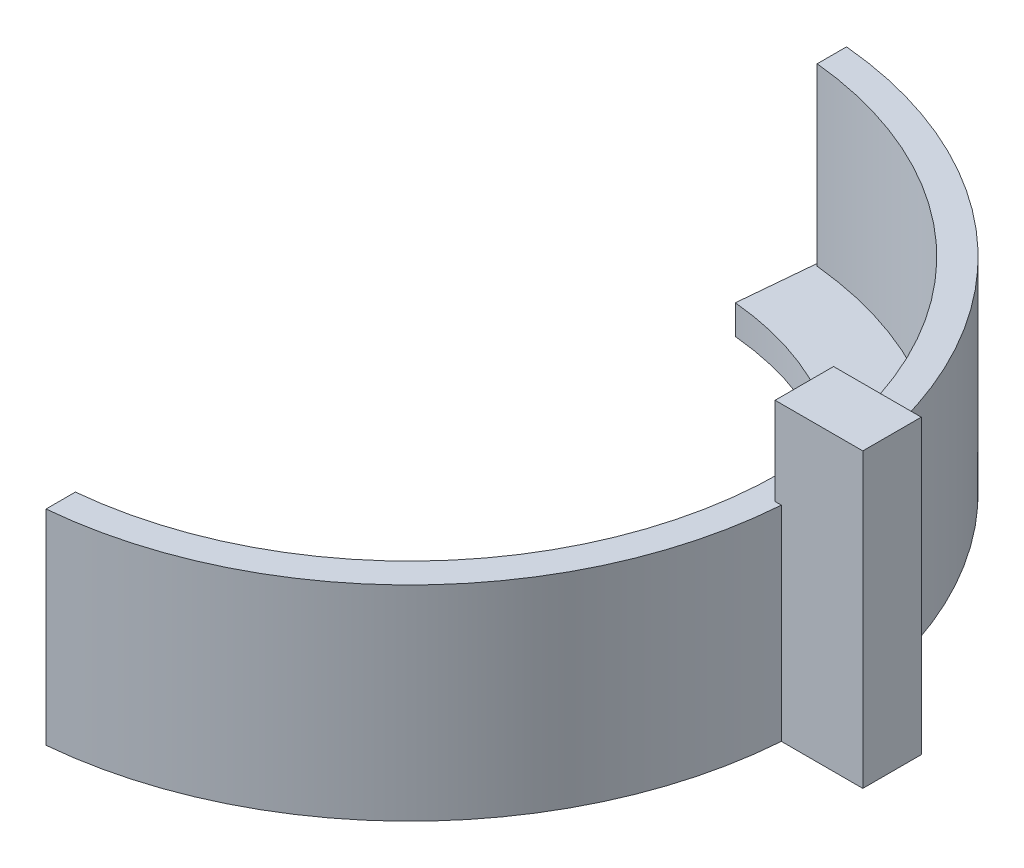
ISO-10303-21;
HEADER;
FILE_DESCRIPTION(('STEP AP214'),'2;1');
FILE_NAME('part.step','',(''),(''),'','','');
FILE_SCHEMA(('AUTOMOTIVE_DESIGN { 1 0 10303 214 1 1 1 1 }'));
ENDSEC;
DATA;
#1=APPLICATION_CONTEXT('core data for automotive mechanical design processes');
#2=APPLICATION_PROTOCOL_DEFINITION('international standard','automotive_design',2000,#1);
#3=PRODUCT_CONTEXT('',#1,'mechanical');
#4=PRODUCT('Part','Part','',(#3));
#5=PRODUCT_RELATED_PRODUCT_CATEGORY('part','',(#4));
#6=PRODUCT_DEFINITION_FORMATION('','',#4);
#7=PRODUCT_DEFINITION_CONTEXT('part definition',#1,'design');
#8=PRODUCT_DEFINITION('design','',#6,#7);
#9=PRODUCT_DEFINITION_SHAPE('','',#8);
#10=(LENGTH_UNIT() NAMED_UNIT(*) SI_UNIT(.MILLI.,.METRE.));
#11=(NAMED_UNIT(*) PLANE_ANGLE_UNIT() SI_UNIT($,.RADIAN.));
#12=(NAMED_UNIT(*) SI_UNIT($,.STERADIAN.) SOLID_ANGLE_UNIT());
#13=UNCERTAINTY_MEASURE_WITH_UNIT(LENGTH_MEASURE(1.E-05),#10,'distance_accuracy_value','');
#14=(GEOMETRIC_REPRESENTATION_CONTEXT(3) GLOBAL_UNCERTAINTY_ASSIGNED_CONTEXT((#13)) GLOBAL_UNIT_ASSIGNED_CONTEXT((#10,
#11,#12)) REPRESENTATION_CONTEXT('',''));
#15=CARTESIAN_POINT('',(0.,0.,0.));
#16=DIRECTION('',(0.,0.,1.));
#17=DIRECTION('',(1.,0.,0.));
#18=AXIS2_PLACEMENT_3D('',#15,#16,#17);
#19=CARTESIAN_POINT('',(0.,12.,0.));
#20=DIRECTION('',(0.,-1.,0.));
#21=DIRECTION('',(0.,0.,-1.));
#22=AXIS2_PLACEMENT_3D('',#19,#20,#21);
#23=CYLINDRICAL_SURFACE('',#22,27.5);
#24=DIRECTION('',(0.,-1.,0.));
#25=VECTOR('',#24,1.);
#26=CARTESIAN_POINT('',(27.427176303805,12.,-2.));
#27=LINE('',#26,#25);
#28=CARTESIAN_POINT('',(27.4271763038049,-2.,-2.));
#29=VERTEX_POINT('',#28);
#30=CARTESIAN_POINT('',(27.427176303805,12.,-2.));
#31=VERTEX_POINT('',#30);
#32=EDGE_CURVE('E176',#29,#31,#27,.F.);
#33=ORIENTED_EDGE('',*,*,#32,.F.);
#34=CARTESIAN_POINT('',(0.,-2.,0.));
#35=DIRECTION('',(0.,1.,0.));
#36=DIRECTION('',(0.,0.,-1.));
#37=AXIS2_PLACEMENT_3D('',#34,#35,#36);
#38=CIRCLE('',#37,27.5);
#39=CARTESIAN_POINT('',(2.5,-2.,-27.3861278752583));
#40=VERTEX_POINT('',#39);
#41=EDGE_CURVE('E167',#29,#40,#38,.T.);
#42=ORIENTED_EDGE('',*,*,#41,.T.);
#43=DIRECTION('',(0.,1.,0.));
#44=VECTOR('',#43,1.);
#45=CARTESIAN_POINT('',(2.5,-2.,-27.3861278752583));
#46=LINE('',#45,#44);
#47=CARTESIAN_POINT('',(2.5,0.,-27.3861278752583));
#48=VERTEX_POINT('',#47);
#49=EDGE_CURVE('E148',#40,#48,#46,.T.);
#50=ORIENTED_EDGE('',*,*,#49,.T.);
#51=DIRECTION('',(0.,-1.,0.));
#52=VECTOR('',#51,1.);
#53=CARTESIAN_POINT('',(2.5,12.,-27.3861278752583));
#54=LINE('',#53,#52);
#55=CARTESIAN_POINT('',(2.5,12.,-27.3861278752583));
#56=VERTEX_POINT('',#55);
#57=EDGE_CURVE('E11',#56,#48,#54,.T.);
#58=ORIENTED_EDGE('',*,*,#57,.F.);
#59=CARTESIAN_POINT('',(0.,12.,0.));
#60=DIRECTION('',(0.,1.,0.));
#61=DIRECTION('',(0.,0.,1.));
#62=AXIS2_PLACEMENT_3D('',#59,#60,#61);
#63=CIRCLE('',#62,27.5);
#64=EDGE_CURVE('E102',#31,#56,#63,.T.);
#65=ORIENTED_EDGE('',*,*,#64,.F.);
#66=EDGE_LOOP('',(#33,#42,#50,#58,#65));
#67=FACE_BOUND('',#66,.T.);
#68=ADVANCED_FACE('F39',(#67),#23,.T.);
#69=DIRECTION('',(0.,-1.,0.));
#70=VECTOR('',#69,1.);
#71=CARTESIAN_POINT('',(27.427176303805,12.,2.));
#72=LINE('',#71,#70);
#73=CARTESIAN_POINT('',(27.427176303805,12.,2.));
#74=VERTEX_POINT('',#73);
#75=CARTESIAN_POINT('',(27.4271763038049,-2.,2.));
#76=VERTEX_POINT('',#75);
#77=EDGE_CURVE('E143',#74,#76,#72,.T.);
#78=ORIENTED_EDGE('',*,*,#77,.F.);
#79=CARTESIAN_POINT('',(2.5,12.,27.3861278752583));
#80=VERTEX_POINT('',#79);
#81=EDGE_CURVE('E106',#80,#74,#63,.T.);
#82=ORIENTED_EDGE('',*,*,#81,.F.);
#83=DIRECTION('',(0.,-1.,0.));
#84=VECTOR('',#83,1.);
#85=CARTESIAN_POINT('',(2.5,12.,27.3861278752583));
#86=LINE('',#85,#84);
#87=CARTESIAN_POINT('',(2.5,0.,27.3861278752583));
#88=VERTEX_POINT('',#87);
#89=EDGE_CURVE('E119',#80,#88,#86,.T.);
#90=ORIENTED_EDGE('',*,*,#89,.T.);
#91=DIRECTION('',(0.,1.,0.));
#92=VECTOR('',#91,1.);
#93=CARTESIAN_POINT('',(2.5,-2.,27.3861278752583));
#94=LINE('',#93,#92);
#95=CARTESIAN_POINT('',(2.5,-2.,27.3861278752583));
#96=VERTEX_POINT('',#95);
#97=EDGE_CURVE('E125',#96,#88,#94,.T.);
#98=ORIENTED_EDGE('',*,*,#97,.F.);
#99=EDGE_CURVE('E188',#96,#76,#38,.T.);
#100=ORIENTED_EDGE('',*,*,#99,.T.);
#101=EDGE_LOOP('',(#78,#82,#90,#98,#100));
#102=FACE_BOUND('',#101,.T.);
#103=ADVANCED_FACE('F139',(#102),#23,.T.);
#104=CARTESIAN_POINT('',(0.,12.,0.));
#105=DIRECTION('',(0.,1.,0.));
#106=DIRECTION('',(0.,0.,1.));
#107=AXIS2_PLACEMENT_3D('',#104,#105,#106);
#108=PLANE('',#107);
#109=DIRECTION('',(0.,0.,-1.));
#110=VECTOR('',#109,1.);
#111=CARTESIAN_POINT('',(27.,12.,0.));
#112=LINE('',#111,#110);
#113=CARTESIAN_POINT('',(27.,12.,2.));
#114=VERTEX_POINT('',#113);
#115=CARTESIAN_POINT('',(27.,12.,-2.));
#116=VERTEX_POINT('',#115);
#117=EDGE_CURVE('E197',#114,#116,#112,.T.);
#118=ORIENTED_EDGE('',*,*,#117,.T.);
#119=DIRECTION('',(1.,0.,0.));
#120=VECTOR('',#119,1.);
#121=CARTESIAN_POINT('',(0.,12.,-2.));
#122=LINE('',#121,#120);
#123=EDGE_CURVE('E194',#116,#31,#122,.T.);
#124=ORIENTED_EDGE('',*,*,#123,.T.);
#125=ORIENTED_EDGE('',*,*,#64,.T.);
#126=DIRECTION('',(0.,0.,1.));
#127=VECTOR('',#126,1.);
#128=CARTESIAN_POINT('',(2.5,12.,-27.3861278752583));
#129=LINE('',#128,#127);
#130=CARTESIAN_POINT('',(2.5,12.,-25.377155080899));
#131=VERTEX_POINT('',#130);
#132=EDGE_CURVE('E93',#56,#131,#129,.T.);
#133=ORIENTED_EDGE('',*,*,#132,.T.);
#134=CARTESIAN_POINT('',(0.,12.,0.));
#135=DIRECTION('',(0.,-1.,0.));
#136=DIRECTION('',(0.,0.,1.));
#137=AXIS2_PLACEMENT_3D('',#134,#135,#136);
#138=CIRCLE('',#137,25.5);
#139=CARTESIAN_POINT('',(2.5,12.,25.377155080899));
#140=VERTEX_POINT('',#139);
#141=EDGE_CURVE('E98',#131,#140,#138,.T.);
#142=ORIENTED_EDGE('',*,*,#141,.T.);
#143=DIRECTION('',(0.,0.,1.));
#144=VECTOR('',#143,1.);
#145=CARTESIAN_POINT('',(2.5,12.,25.377155080899));
#146=LINE('',#145,#144);
#147=EDGE_CURVE('E63',#140,#80,#146,.T.);
#148=ORIENTED_EDGE('',*,*,#147,.T.);
#149=ORIENTED_EDGE('',*,*,#81,.T.);
#150=DIRECTION('',(-1.,0.,0.));
#151=VECTOR('',#150,1.);
#152=CARTESIAN_POINT('',(0.,12.,2.));
#153=LINE('',#152,#151);
#154=EDGE_CURVE('E202',#74,#114,#153,.T.);
#155=ORIENTED_EDGE('',*,*,#154,.T.);
#156=EDGE_LOOP('',(#118,#124,#125,#133,#142,#148,#149,#155));
#157=FACE_BOUND('',#156,.T.);
#158=ADVANCED_FACE('F96',(#157),#108,.T.);
#159=CARTESIAN_POINT('',(2.5,12.,-27.3861278752583));
#160=DIRECTION('',(1.,0.,0.));
#161=DIRECTION('',(0.,0.,-1.));
#162=AXIS2_PLACEMENT_3D('',#159,#160,#161);
#163=PLANE('',#162);
#164=DIRECTION('',(0.,0.,1.));
#165=VECTOR('',#164,1.);
#166=CARTESIAN_POINT('',(2.5,0.,-27.3861278752583));
#167=LINE('',#166,#165);
#168=CARTESIAN_POINT('',(2.5,0.,-25.377155080899));
#169=VERTEX_POINT('',#168);
#170=EDGE_CURVE('E110',#48,#169,#167,.T.);
#171=ORIENTED_EDGE('',*,*,#170,.T.);
#172=DIRECTION('',(0.,-1.,0.));
#173=VECTOR('',#172,1.);
#174=CARTESIAN_POINT('',(2.5,12.,-25.377155080899));
#175=LINE('',#174,#173);
#176=EDGE_CURVE('E47',#131,#169,#175,.T.);
#177=ORIENTED_EDGE('',*,*,#176,.F.);
#178=ORIENTED_EDGE('',*,*,#132,.F.);
#179=ORIENTED_EDGE('',*,*,#57,.T.);
#180=EDGE_LOOP('',(#171,#177,#178,#179));
#181=FACE_BOUND('',#180,.T.);
#182=ADVANCED_FACE('F109',(#181),#163,.F.);
#183=CARTESIAN_POINT('',(0.,12.,0.));
#184=DIRECTION('',(0.,-1.,0.));
#185=DIRECTION('',(0.,0.,-1.));
#186=AXIS2_PLACEMENT_3D('',#183,#184,#185);
#187=CYLINDRICAL_SURFACE('',#186,25.5);
#188=CARTESIAN_POINT('',(0.,0.,0.));
#189=DIRECTION('',(0.,-1.,0.));
#190=DIRECTION('',(0.,0.,1.));
#191=AXIS2_PLACEMENT_3D('',#188,#189,#190);
#192=CIRCLE('',#191,25.5);
#193=CARTESIAN_POINT('',(2.5,0.,25.377155080899));
#194=VERTEX_POINT('',#193);
#195=EDGE_CURVE('E76',#169,#194,#192,.T.);
#196=ORIENTED_EDGE('',*,*,#195,.T.);
#197=DIRECTION('',(0.,-1.,0.));
#198=VECTOR('',#197,1.);
#199=CARTESIAN_POINT('',(2.5,12.,25.377155080899));
#200=LINE('',#199,#198);
#201=EDGE_CURVE('E113',#140,#194,#200,.T.);
#202=ORIENTED_EDGE('',*,*,#201,.F.);
#203=ORIENTED_EDGE('',*,*,#141,.F.);
#204=ORIENTED_EDGE('',*,*,#176,.T.);
#205=EDGE_LOOP('',(#196,#202,#203,#204));
#206=FACE_BOUND('',#205,.T.);
#207=ADVANCED_FACE('F114',(#206),#187,.F.);
#208=CARTESIAN_POINT('',(2.5,12.,25.377155080899));
#209=DIRECTION('',(1.,0.,0.));
#210=DIRECTION('',(0.,0.,-1.));
#211=AXIS2_PLACEMENT_3D('',#208,#209,#210);
#212=PLANE('',#211);
#213=DIRECTION('',(0.,0.,1.));
#214=VECTOR('',#213,1.);
#215=CARTESIAN_POINT('',(2.5,0.,25.377155080899));
#216=LINE('',#215,#214);
#217=EDGE_CURVE('E84',#194,#88,#216,.T.);
#218=ORIENTED_EDGE('',*,*,#217,.T.);
#219=ORIENTED_EDGE('',*,*,#89,.F.);
#220=ORIENTED_EDGE('',*,*,#147,.F.);
#221=ORIENTED_EDGE('',*,*,#201,.T.);
#222=EDGE_LOOP('',(#218,#219,#220,#221));
#223=FACE_BOUND('',#222,.T.);
#224=ADVANCED_FACE('F135',(#223),#212,.F.);
#225=CARTESIAN_POINT('',(2.5,-2.,27.3861278752583));
#226=DIRECTION('',(-0.995859195463938,0.,0.0909090909090934));
#227=DIRECTION('',(0.0909090909090934,0.,0.995859195463938));
#228=AXIS2_PLACEMENT_3D('',#225,#226,#227);
#229=PLANE('',#228);
#230=DIRECTION('',(0.0909090909090934,0.,0.995859195463938));
#231=VECTOR('',#230,1.);
#232=CARTESIAN_POINT('',(2.5,0.,27.3861278752583));
#233=LINE('',#232,#231);
#234=CARTESIAN_POINT('',(1.86363636363634,0.,20.4151135070107));
#235=VERTEX_POINT('',#234);
#236=EDGE_CURVE('E164',#235,#88,#233,.T.);
#237=ORIENTED_EDGE('',*,*,#236,.F.);
#238=DIRECTION('',(0.,1.,0.));
#239=VECTOR('',#238,1.);
#240=CARTESIAN_POINT('',(1.86363636363634,-2.,20.4151135070107));
#241=LINE('',#240,#239);
#242=CARTESIAN_POINT('',(1.86363636363634,-2.,20.4151135070107));
#243=VERTEX_POINT('',#242);
#244=EDGE_CURVE('E157',#243,#235,#241,.T.);
#245=ORIENTED_EDGE('',*,*,#244,.F.);
#246=DIRECTION('',(0.0909090909090934,0.,0.995859195463938));
#247=VECTOR('',#246,1.);
#248=CARTESIAN_POINT('',(2.5,-2.,27.3861278752583));
#249=LINE('',#248,#247);
#250=EDGE_CURVE('E153',#243,#96,#249,.T.);
#251=ORIENTED_EDGE('',*,*,#250,.T.);
#252=ORIENTED_EDGE('',*,*,#97,.T.);
#253=EDGE_LOOP('',(#237,#245,#251,#252));
#254=FACE_BOUND('',#253,.T.);
#255=ADVANCED_FACE('F299',(#254),#229,.T.);
#256=CARTESIAN_POINT('',(0.,-2.,0.));
#257=DIRECTION('',(0.,1.,0.));
#258=DIRECTION('',(0.,0.,1.));
#259=AXIS2_PLACEMENT_3D('',#256,#257,#258);
#260=CYLINDRICAL_SURFACE('',#259,20.5);
#261=CARTESIAN_POINT('',(0.,0.,0.));
#262=DIRECTION('',(0.,-1.,0.));
#263=DIRECTION('',(0.,0.,-1.));
#264=AXIS2_PLACEMENT_3D('',#261,#262,#263);
#265=CIRCLE('',#264,20.5);
#266=CARTESIAN_POINT('',(1.86363636363636,0.,-20.4151135070107));
#267=VERTEX_POINT('',#266);
#268=EDGE_CURVE('E168',#267,#235,#265,.T.);
#269=ORIENTED_EDGE('',*,*,#268,.F.);
#270=DIRECTION('',(0.,1.,0.));
#271=VECTOR('',#270,1.);
#272=CARTESIAN_POINT('',(1.86363636363636,-2.,-20.4151135070107));
#273=LINE('',#272,#271);
#274=CARTESIAN_POINT('',(1.86363636363636,-2.,-20.4151135070107));
#275=VERTEX_POINT('',#274);
#276=EDGE_CURVE('E152',#275,#267,#273,.T.);
#277=ORIENTED_EDGE('',*,*,#276,.F.);
#278=CARTESIAN_POINT('',(0.,-2.,0.));
#279=DIRECTION('',(0.,-1.,0.));
#280=DIRECTION('',(0.,0.,-1.));
#281=AXIS2_PLACEMENT_3D('',#278,#279,#280);
#282=CIRCLE('',#281,20.5);
#283=EDGE_CURVE('E180',#275,#243,#282,.T.);
#284=ORIENTED_EDGE('',*,*,#283,.T.);
#285=ORIENTED_EDGE('',*,*,#244,.T.);
#286=EDGE_LOOP('',(#269,#277,#284,#285));
#287=FACE_BOUND('',#286,.T.);
#288=ADVANCED_FACE('F304',(#287),#260,.F.);
#289=CARTESIAN_POINT('',(2.5,-2.,-27.3861278752583));
#290=DIRECTION('',(-0.995859195463938,0.,-0.0909090909090919));
#291=DIRECTION('',(-0.0909090909090919,0.,0.995859195463938));
#292=AXIS2_PLACEMENT_3D('',#289,#290,#291);
#293=PLANE('',#292);
#294=DIRECTION('',(-0.0909090909090919,0.,0.995859195463938));
#295=VECTOR('',#294,1.);
#296=CARTESIAN_POINT('',(2.5,0.,-27.3861278752583));
#297=LINE('',#296,#295);
#298=EDGE_CURVE('E172',#48,#267,#297,.T.);
#299=ORIENTED_EDGE('',*,*,#298,.F.);
#300=ORIENTED_EDGE('',*,*,#49,.F.);
#301=DIRECTION('',(-0.0909090909090919,0.,0.995859195463938));
#302=VECTOR('',#301,1.);
#303=CARTESIAN_POINT('',(2.5,-2.,-27.3861278752583));
#304=LINE('',#303,#302);
#305=EDGE_CURVE('E184',#40,#275,#304,.T.);
#306=ORIENTED_EDGE('',*,*,#305,.T.);
#307=ORIENTED_EDGE('',*,*,#276,.T.);
#308=EDGE_LOOP('',(#299,#300,#306,#307));
#309=FACE_BOUND('',#308,.T.);
#310=ADVANCED_FACE('F310',(#309),#293,.T.);
#311=CARTESIAN_POINT('',(0.,-2.,0.));
#312=DIRECTION('',(0.,-1.,0.));
#313=DIRECTION('',(0.,0.,-1.));
#314=AXIS2_PLACEMENT_3D('',#311,#312,#313);
#315=PLANE('',#314);
#316=ORIENTED_EDGE('',*,*,#41,.F.);
#317=DIRECTION('',(-1.,0.,0.));
#318=VECTOR('',#317,1.);
#319=CARTESIAN_POINT('',(27.,-2.,-2.));
#320=LINE('',#319,#318);
#321=CARTESIAN_POINT('',(33.,-2.,-2.));
#322=VERTEX_POINT('',#321);
#323=EDGE_CURVE('E225',#322,#29,#320,.T.);
#324=ORIENTED_EDGE('',*,*,#323,.F.);
#325=DIRECTION('',(0.,0.,-1.));
#326=VECTOR('',#325,1.);
#327=CARTESIAN_POINT('',(33.,-2.,-2.));
#328=LINE('',#327,#326);
#329=CARTESIAN_POINT('',(33.,-2.,2.));
#330=VERTEX_POINT('',#329);
#331=EDGE_CURVE('E229',#330,#322,#328,.T.);
#332=ORIENTED_EDGE('',*,*,#331,.F.);
#333=DIRECTION('',(1.,0.,0.));
#334=VECTOR('',#333,1.);
#335=CARTESIAN_POINT('',(27.,-2.,2.));
#336=LINE('',#335,#334);
#337=EDGE_CURVE('E220',#76,#330,#336,.T.);
#338=ORIENTED_EDGE('',*,*,#337,.F.);
#339=ORIENTED_EDGE('',*,*,#99,.F.);
#340=ORIENTED_EDGE('',*,*,#250,.F.);
#341=ORIENTED_EDGE('',*,*,#283,.F.);
#342=ORIENTED_EDGE('',*,*,#305,.F.);
#343=EDGE_LOOP('',(#316,#324,#332,#338,#339,#340,#341,#342));
#344=FACE_BOUND('',#343,.T.);
#345=ADVANCED_FACE('F308',(#344),#315,.T.);
#346=CARTESIAN_POINT('',(0.,0.,0.));
#347=DIRECTION('',(0.,-1.,0.));
#348=DIRECTION('',(0.,0.,-1.));
#349=AXIS2_PLACEMENT_3D('',#346,#347,#348);
#350=PLANE('',#349);
#351=ORIENTED_EDGE('',*,*,#217,.F.);
#352=ORIENTED_EDGE('',*,*,#195,.F.);
#353=ORIENTED_EDGE('',*,*,#170,.F.);
#354=ORIENTED_EDGE('',*,*,#298,.T.);
#355=ORIENTED_EDGE('',*,*,#268,.T.);
#356=ORIENTED_EDGE('',*,*,#236,.T.);
#357=EDGE_LOOP('',(#351,#352,#353,#354,#355,#356));
#358=FACE_BOUND('',#357,.T.);
#359=ADVANCED_FACE('F302',(#358),#350,.F.);
#360=CARTESIAN_POINT('',(27.,18.,-2.));
#361=DIRECTION('',(0.,0.,1.));
#362=DIRECTION('',(1.,0.,0.));
#363=AXIS2_PLACEMENT_3D('',#360,#361,#362);
#364=PLANE('',#363);
#365=ORIENTED_EDGE('',*,*,#323,.T.);
#366=ORIENTED_EDGE('',*,*,#32,.T.);
#367=ORIENTED_EDGE('',*,*,#123,.F.);
#368=DIRECTION('',(0.,-1.,0.));
#369=VECTOR('',#368,1.);
#370=CARTESIAN_POINT('',(27.,18.,-2.));
#371=LINE('',#370,#369);
#372=CARTESIAN_POINT('',(27.,18.,-2.));
#373=VERTEX_POINT('',#372);
#374=EDGE_CURVE('E209',#373,#116,#371,.T.);
#375=ORIENTED_EDGE('',*,*,#374,.F.);
#376=DIRECTION('',(-1.,0.,0.));
#377=VECTOR('',#376,1.);
#378=CARTESIAN_POINT('',(27.,18.,-2.));
#379=LINE('',#378,#377);
#380=CARTESIAN_POINT('',(33.,18.,-2.));
#381=VERTEX_POINT('',#380);
#382=EDGE_CURVE('E240',#381,#373,#379,.T.);
#383=ORIENTED_EDGE('',*,*,#382,.F.);
#384=DIRECTION('',(0.,-1.,0.));
#385=VECTOR('',#384,1.);
#386=CARTESIAN_POINT('',(33.,18.,-2.));
#387=LINE('',#386,#385);
#388=EDGE_CURVE('E205',#381,#322,#387,.T.);
#389=ORIENTED_EDGE('',*,*,#388,.T.);
#390=EDGE_LOOP('',(#365,#366,#367,#375,#383,#389));
#391=FACE_BOUND('',#390,.T.);
#392=ADVANCED_FACE('F263',(#391),#364,.F.);
#393=CARTESIAN_POINT('',(27.,18.,2.));
#394=DIRECTION('',(0.,0.,-1.));
#395=DIRECTION('',(-1.,0.,0.));
#396=AXIS2_PLACEMENT_3D('',#393,#394,#395);
#397=PLANE('',#396);
#398=ORIENTED_EDGE('',*,*,#154,.F.);
#399=ORIENTED_EDGE('',*,*,#77,.T.);
#400=ORIENTED_EDGE('',*,*,#337,.T.);
#401=DIRECTION('',(0.,-1.,0.));
#402=VECTOR('',#401,1.);
#403=CARTESIAN_POINT('',(33.,18.,2.));
#404=LINE('',#403,#402);
#405=CARTESIAN_POINT('',(33.,18.,2.));
#406=VERTEX_POINT('',#405);
#407=EDGE_CURVE('E215',#406,#330,#404,.T.);
#408=ORIENTED_EDGE('',*,*,#407,.F.);
#409=DIRECTION('',(1.,0.,0.));
#410=VECTOR('',#409,1.);
#411=CARTESIAN_POINT('',(27.,18.,2.));
#412=LINE('',#411,#410);
#413=CARTESIAN_POINT('',(27.,18.,2.));
#414=VERTEX_POINT('',#413);
#415=EDGE_CURVE('E219',#414,#406,#412,.T.);
#416=ORIENTED_EDGE('',*,*,#415,.F.);
#417=DIRECTION('',(0.,-1.,0.));
#418=VECTOR('',#417,1.);
#419=CARTESIAN_POINT('',(27.,18.,2.));
#420=LINE('',#419,#418);
#421=EDGE_CURVE('E54',#414,#114,#420,.T.);
#422=ORIENTED_EDGE('',*,*,#421,.T.);
#423=EDGE_LOOP('',(#398,#399,#400,#408,#416,#422));
#424=FACE_BOUND('',#423,.T.);
#425=ADVANCED_FACE('F318',(#424),#397,.F.);
#426=CARTESIAN_POINT('',(33.,18.,-2.));
#427=DIRECTION('',(-1.,0.,0.));
#428=DIRECTION('',(0.,0.,1.));
#429=AXIS2_PLACEMENT_3D('',#426,#427,#428);
#430=PLANE('',#429);
#431=ORIENTED_EDGE('',*,*,#331,.T.);
#432=ORIENTED_EDGE('',*,*,#388,.F.);
#433=DIRECTION('',(0.,0.,-1.));
#434=VECTOR('',#433,1.);
#435=CARTESIAN_POINT('',(33.,18.,-2.));
#436=LINE('',#435,#434);
#437=EDGE_CURVE('E224',#406,#381,#436,.T.);
#438=ORIENTED_EDGE('',*,*,#437,.F.);
#439=ORIENTED_EDGE('',*,*,#407,.T.);
#440=EDGE_LOOP('',(#431,#432,#438,#439));
#441=FACE_BOUND('',#440,.T.);
#442=ADVANCED_FACE('F259',(#441),#430,.F.);
#443=CARTESIAN_POINT('',(27.,18.,-2.));
#444=DIRECTION('',(1.,0.,0.));
#445=DIRECTION('',(0.,0.,-1.));
#446=AXIS2_PLACEMENT_3D('',#443,#444,#445);
#447=PLANE('',#446);
#448=ORIENTED_EDGE('',*,*,#117,.F.);
#449=ORIENTED_EDGE('',*,*,#421,.F.);
#450=DIRECTION('',(0.,0.,1.));
#451=VECTOR('',#450,1.);
#452=CARTESIAN_POINT('',(27.,18.,-2.));
#453=LINE('',#452,#451);
#454=EDGE_CURVE('E236',#373,#414,#453,.T.);
#455=ORIENTED_EDGE('',*,*,#454,.F.);
#456=ORIENTED_EDGE('',*,*,#374,.T.);
#457=EDGE_LOOP('',(#448,#449,#455,#456));
#458=FACE_BOUND('',#457,.T.);
#459=ADVANCED_FACE('F314',(#458),#447,.F.);
#460=CARTESIAN_POINT('',(0.,18.,0.));
#461=DIRECTION('',(0.,1.,0.));
#462=DIRECTION('',(0.,0.,1.));
#463=AXIS2_PLACEMENT_3D('',#460,#461,#462);
#464=PLANE('',#463);
#465=ORIENTED_EDGE('',*,*,#437,.T.);
#466=ORIENTED_EDGE('',*,*,#382,.T.);
#467=ORIENTED_EDGE('',*,*,#454,.T.);
#468=ORIENTED_EDGE('',*,*,#415,.T.);
#469=EDGE_LOOP('',(#465,#466,#467,#468));
#470=FACE_BOUND('',#469,.T.);
#471=ADVANCED_FACE('F250',(#470),#464,.T.);
#472=CLOSED_SHELL('',(#68,#103,#158,#182,#207,#224,#255,#288,#310,#345,#359,#392,#425,#442,#459,#471));
#473=MANIFOLD_SOLID_BREP('B2',#472);
#474=ADVANCED_BREP_SHAPE_REPRESENTATION('',(#18,#473),#14);
#475=SHAPE_DEFINITION_REPRESENTATION(#9,#474);
ENDSEC;
END-ISO-10303-21;
